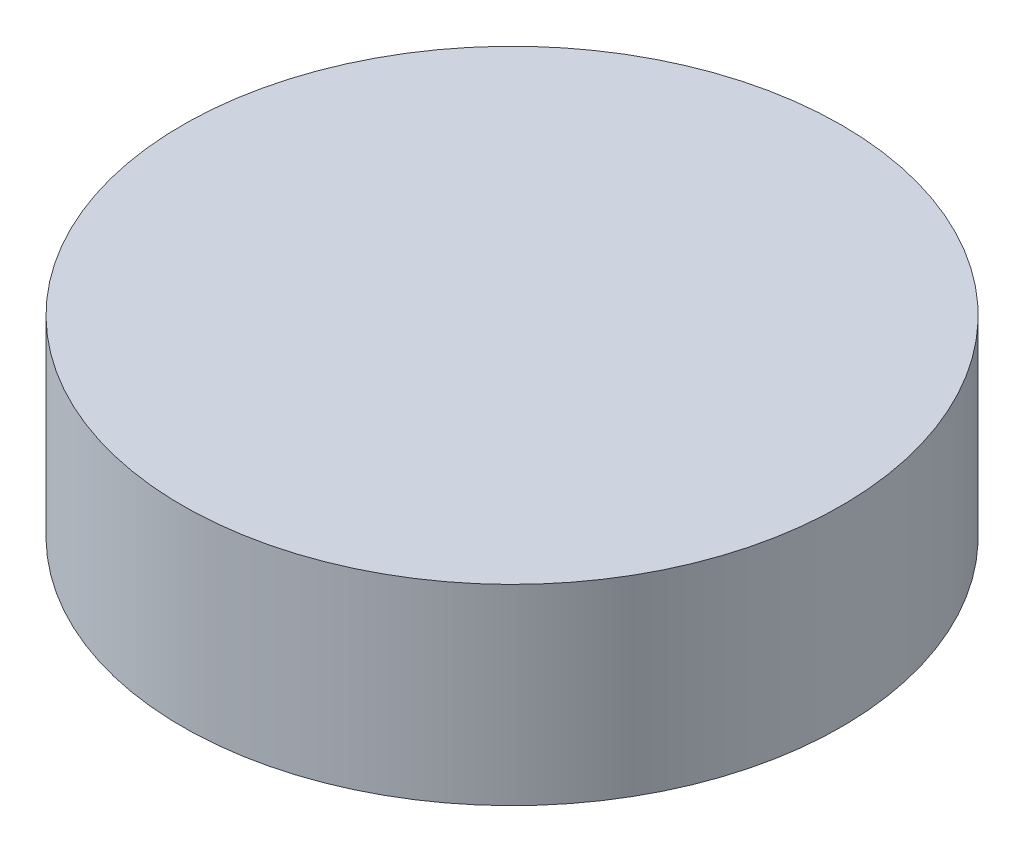
ISO-10303-21;
HEADER;
FILE_DESCRIPTION(('STEP AP214'),'2;1');
FILE_NAME('part.step','',(''),(''),'','','');
FILE_SCHEMA(('AUTOMOTIVE_DESIGN { 1 0 10303 214 1 1 1 1 }'));
ENDSEC;
DATA;
#1=APPLICATION_CONTEXT('core data for automotive mechanical design processes');
#2=APPLICATION_PROTOCOL_DEFINITION('international standard','automotive_design',2000,#1);
#3=PRODUCT_CONTEXT('',#1,'mechanical');
#4=PRODUCT('Part','Part','',(#3));
#5=PRODUCT_RELATED_PRODUCT_CATEGORY('part','',(#4));
#6=PRODUCT_DEFINITION_FORMATION('','',#4);
#7=PRODUCT_DEFINITION_CONTEXT('part definition',#1,'design');
#8=PRODUCT_DEFINITION('design','',#6,#7);
#9=PRODUCT_DEFINITION_SHAPE('','',#8);
#10=(LENGTH_UNIT() NAMED_UNIT(*) SI_UNIT(.MILLI.,.METRE.));
#11=(NAMED_UNIT(*) PLANE_ANGLE_UNIT() SI_UNIT($,.RADIAN.));
#12=(NAMED_UNIT(*) SI_UNIT($,.STERADIAN.) SOLID_ANGLE_UNIT());
#13=UNCERTAINTY_MEASURE_WITH_UNIT(LENGTH_MEASURE(1.E-05),#10,'distance_accuracy_value','');
#14=(GEOMETRIC_REPRESENTATION_CONTEXT(3) GLOBAL_UNCERTAINTY_ASSIGNED_CONTEXT((#13)) GLOBAL_UNIT_ASSIGNED_CONTEXT((#10,
#11,#12)) REPRESENTATION_CONTEXT('',''));
#15=CARTESIAN_POINT('',(0.,0.,0.));
#16=DIRECTION('',(0.,0.,1.));
#17=DIRECTION('',(1.,0.,0.));
#18=AXIS2_PLACEMENT_3D('',#15,#16,#17);
#19=CARTESIAN_POINT('',(0.,-3.175,0.));
#20=DIRECTION('',(0.,-1.,0.));
#21=DIRECTION('',(0.,0.,-1.));
#22=AXIS2_PLACEMENT_3D('',#19,#20,#21);
#23=CYLINDRICAL_SURFACE('',#22,40.513);
#24=CARTESIAN_POINT('',(0.,-25.4,0.));
#25=DIRECTION('',(0.,-1.,0.));
#26=DIRECTION('',(0.,0.,-1.));
#27=AXIS2_PLACEMENT_3D('',#24,#25,#26);
#28=CIRCLE('',#27,40.513);
#29=CARTESIAN_POINT('',(0.,-25.4,-40.513));
#30=VERTEX_POINT('',#29);
#31=EDGE_CURVE('E108',#30,#30,#28,.T.);
#32=ORIENTED_EDGE('',*,*,#31,.T.);
#33=EDGE_LOOP('',(#32));
#34=FACE_BOUND('',#33,.T.);
#35=CARTESIAN_POINT('',(0.,-3.17499999999999,0.));
#36=DIRECTION('',(0.,-1.,0.));
#37=DIRECTION('',(0.,0.,-1.));
#38=AXIS2_PLACEMENT_3D('',#35,#36,#37);
#39=CIRCLE('',#38,40.513);
#40=CARTESIAN_POINT('',(40.505223489539,-3.175,0.79375));
#41=VERTEX_POINT('',#40);
#42=CARTESIAN_POINT('',(-40.505223489539,-3.175,0.79375));
#43=VERTEX_POINT('',#42);
#44=EDGE_CURVE('E102',#41,#43,#39,.T.);
#45=ORIENTED_EDGE('',*,*,#44,.F.);
#46=DIRECTION('',(0.,-1.,0.));
#47=VECTOR('',#46,1.);
#48=CARTESIAN_POINT('',(40.505223489539,-3.175,0.79375));
#49=LINE('',#48,#47);
#50=CARTESIAN_POINT('',(40.505223489539,-9.525,0.79375));
#51=VERTEX_POINT('',#50);
#52=EDGE_CURVE('E103',#41,#51,#49,.T.);
#53=ORIENTED_EDGE('',*,*,#52,.T.);
#54=CARTESIAN_POINT('',(0.,-9.525,0.));
#55=DIRECTION('',(0.,-1.,0.));
#56=DIRECTION('',(0.,0.,-1.));
#57=AXIS2_PLACEMENT_3D('',#54,#55,#56);
#58=CIRCLE('',#57,40.513);
#59=CARTESIAN_POINT('',(40.505223489539,-9.525,-0.79375));
#60=VERTEX_POINT('',#59);
#61=EDGE_CURVE('E11',#60,#51,#58,.T.);
#62=ORIENTED_EDGE('',*,*,#61,.F.);
#63=DIRECTION('',(0.,-1.,0.));
#64=VECTOR('',#63,1.);
#65=CARTESIAN_POINT('',(40.505223489539,-3.175,-0.79375));
#66=LINE('',#65,#64);
#67=CARTESIAN_POINT('',(40.505223489539,-3.175,-0.79375));
#68=VERTEX_POINT('',#67);
#69=EDGE_CURVE('E85',#60,#68,#66,.F.);
#70=ORIENTED_EDGE('',*,*,#69,.T.);
#71=CARTESIAN_POINT('',(-40.505223489539,-3.17499999999999,-0.79375));
#72=VERTEX_POINT('',#71);
#73=EDGE_CURVE('E95',#72,#68,#39,.T.);
#74=ORIENTED_EDGE('',*,*,#73,.F.);
#75=DIRECTION('',(0.,-1.,0.));
#76=VECTOR('',#75,1.);
#77=CARTESIAN_POINT('',(-40.505223489539,-3.175,-0.79375));
#78=LINE('',#77,#76);
#79=CARTESIAN_POINT('',(-40.505223489539,-9.525,-0.79375));
#80=VERTEX_POINT('',#79);
#81=EDGE_CURVE('E59',#72,#80,#78,.T.);
#82=ORIENTED_EDGE('',*,*,#81,.T.);
#83=CARTESIAN_POINT('',(-40.505223489539,-9.525,0.79375));
#84=VERTEX_POINT('',#83);
#85=EDGE_CURVE('E47',#84,#80,#58,.T.);
#86=ORIENTED_EDGE('',*,*,#85,.F.);
#87=DIRECTION('',(0.,-1.,0.));
#88=VECTOR('',#87,1.);
#89=CARTESIAN_POINT('',(-40.505223489539,-3.175,0.79375));
#90=LINE('',#89,#88);
#91=EDGE_CURVE('E109',#84,#43,#90,.F.);
#92=ORIENTED_EDGE('',*,*,#91,.T.);
#93=EDGE_LOOP('',(#45,#53,#62,#70,#74,#82,#86,#92));
#94=FACE_BOUND('',#93,.T.);
#95=ADVANCED_FACE('F43',(#34,#94),#23,.F.);
#96=CARTESIAN_POINT('',(40.513,-3.175,0.));
#97=DIRECTION('',(0.,-1.,0.));
#98=DIRECTION('',(0.,0.,-1.));
#99=AXIS2_PLACEMENT_3D('',#96,#97,#98);
#100=PLANE('',#99);
#101=ORIENTED_EDGE('',*,*,#44,.T.);
#102=DIRECTION('',(1.,0.,0.));
#103=VECTOR('',#102,1.);
#104=CARTESIAN_POINT('',(40.513,-3.175,0.79375));
#105=LINE('',#104,#103);
#106=EDGE_CURVE('E91',#43,#41,#105,.T.);
#107=ORIENTED_EDGE('',*,*,#106,.T.);
#108=EDGE_LOOP('',(#101,#107));
#109=FACE_BOUND('',#108,.T.);
#110=ADVANCED_FACE('F139',(#109),#100,.T.);
#111=ORIENTED_EDGE('',*,*,#73,.T.);
#112=DIRECTION('',(-1.,0.,0.));
#113=VECTOR('',#112,1.);
#114=CARTESIAN_POINT('',(40.513,-3.175,-0.79375));
#115=LINE('',#114,#113);
#116=EDGE_CURVE('E82',#68,#72,#115,.T.);
#117=ORIENTED_EDGE('',*,*,#116,.T.);
#118=EDGE_LOOP('',(#111,#117));
#119=FACE_BOUND('',#118,.T.);
#120=ADVANCED_FACE('F100',(#119),#100,.T.);
#121=CARTESIAN_POINT('',(0.,0.,0.));
#122=DIRECTION('',(0.,1.,0.));
#123=DIRECTION('',(0.,0.,1.));
#124=AXIS2_PLACEMENT_3D('',#121,#122,#123);
#125=PLANE('',#124);
#126=CARTESIAN_POINT('',(0.,0.,0.));
#127=DIRECTION('',(0.,-1.,0.));
#128=DIRECTION('',(0.,0.,-1.));
#129=AXIS2_PLACEMENT_3D('',#126,#127,#128);
#130=CIRCLE('',#129,43.688);
#131=CARTESIAN_POINT('',(0.,0.,-43.688));
#132=VERTEX_POINT('',#131);
#133=EDGE_CURVE('E92',#132,#132,#130,.T.);
#134=ORIENTED_EDGE('',*,*,#133,.F.);
#135=EDGE_LOOP('',(#134));
#136=FACE_BOUND('',#135,.T.);
#137=ADVANCED_FACE('F45',(#136),#125,.T.);
#138=CARTESIAN_POINT('',(0.,-3.175,0.));
#139=DIRECTION('',(0.,-1.,0.));
#140=DIRECTION('',(0.,0.,-1.));
#141=AXIS2_PLACEMENT_3D('',#138,#139,#140);
#142=CYLINDRICAL_SURFACE('',#141,43.688);
#143=ORIENTED_EDGE('',*,*,#133,.T.);
#144=EDGE_LOOP('',(#143));
#145=FACE_BOUND('',#144,.T.);
#146=CARTESIAN_POINT('',(0.,-25.4,0.));
#147=DIRECTION('',(0.,-1.,0.));
#148=DIRECTION('',(0.,0.,-1.));
#149=AXIS2_PLACEMENT_3D('',#146,#147,#148);
#150=CIRCLE('',#149,43.688);
#151=CARTESIAN_POINT('',(0.,-25.4,-43.688));
#152=VERTEX_POINT('',#151);
#153=EDGE_CURVE('E116',#152,#152,#150,.T.);
#154=ORIENTED_EDGE('',*,*,#153,.F.);
#155=EDGE_LOOP('',(#154));
#156=FACE_BOUND('',#155,.T.);
#157=ADVANCED_FACE('F154',(#145,#156),#142,.T.);
#158=CARTESIAN_POINT('',(43.688,-25.4,0.));
#159=DIRECTION('',(0.,-1.,0.));
#160=DIRECTION('',(0.,0.,-1.));
#161=AXIS2_PLACEMENT_3D('',#158,#159,#160);
#162=PLANE('',#161);
#163=ORIENTED_EDGE('',*,*,#153,.T.);
#164=EDGE_LOOP('',(#163));
#165=FACE_BOUND('',#164,.T.);
#166=ORIENTED_EDGE('',*,*,#31,.F.);
#167=EDGE_LOOP('',(#166));
#168=FACE_BOUND('',#167,.T.);
#169=ADVANCED_FACE('F152',(#165,#168),#162,.T.);
#170=CARTESIAN_POINT('',(0.,-9.525,0.));
#171=DIRECTION('',(0.,-1.,0.));
#172=DIRECTION('',(0.,0.,-1.));
#173=AXIS2_PLACEMENT_3D('',#170,#171,#172);
#174=PLANE('',#173);
#175=DIRECTION('',(1.,0.,0.));
#176=VECTOR('',#175,1.);
#177=CARTESIAN_POINT('',(-40.513,-9.525,-0.79375));
#178=LINE('',#177,#176);
#179=EDGE_CURVE('E98',#80,#60,#178,.T.);
#180=ORIENTED_EDGE('',*,*,#179,.T.);
#181=ORIENTED_EDGE('',*,*,#61,.T.);
#182=DIRECTION('',(-1.,0.,0.));
#183=VECTOR('',#182,1.);
#184=CARTESIAN_POINT('',(-40.513,-9.525,0.79375));
#185=LINE('',#184,#183);
#186=EDGE_CURVE('E130',#51,#84,#185,.T.);
#187=ORIENTED_EDGE('',*,*,#186,.T.);
#188=ORIENTED_EDGE('',*,*,#85,.T.);
#189=EDGE_LOOP('',(#180,#181,#187,#188));
#190=FACE_BOUND('',#189,.T.);
#191=ADVANCED_FACE('F128',(#190),#174,.T.);
#192=CARTESIAN_POINT('',(-40.513,-9.525,0.79375));
#193=DIRECTION('',(0.,0.,-1.));
#194=DIRECTION('',(-1.,0.,0.));
#195=AXIS2_PLACEMENT_3D('',#192,#193,#194);
#196=PLANE('',#195);
#197=ORIENTED_EDGE('',*,*,#52,.F.);
#198=ORIENTED_EDGE('',*,*,#106,.F.);
#199=ORIENTED_EDGE('',*,*,#91,.F.);
#200=ORIENTED_EDGE('',*,*,#186,.F.);
#201=EDGE_LOOP('',(#197,#198,#199,#200));
#202=FACE_BOUND('',#201,.T.);
#203=ADVANCED_FACE('F149',(#202),#196,.F.);
#204=CARTESIAN_POINT('',(-40.513,-9.525,-0.79375));
#205=DIRECTION('',(0.,0.,1.));
#206=DIRECTION('',(1.,0.,0.));
#207=AXIS2_PLACEMENT_3D('',#204,#205,#206);
#208=PLANE('',#207);
#209=ORIENTED_EDGE('',*,*,#81,.F.);
#210=ORIENTED_EDGE('',*,*,#116,.F.);
#211=ORIENTED_EDGE('',*,*,#69,.F.);
#212=ORIENTED_EDGE('',*,*,#179,.F.);
#213=EDGE_LOOP('',(#209,#210,#211,#212));
#214=FACE_BOUND('',#213,.T.);
#215=ADVANCED_FACE('F84',(#214),#208,.F.);
#216=CLOSED_SHELL('',(#95,#110,#120,#137,#157,#169,#191,#203,#215));
#217=MANIFOLD_SOLID_BREP('B2',#216);
#218=ADVANCED_BREP_SHAPE_REPRESENTATION('',(#18,#217),#14);
#219=SHAPE_DEFINITION_REPRESENTATION(#9,#218);
ENDSEC;
END-ISO-10303-21;
